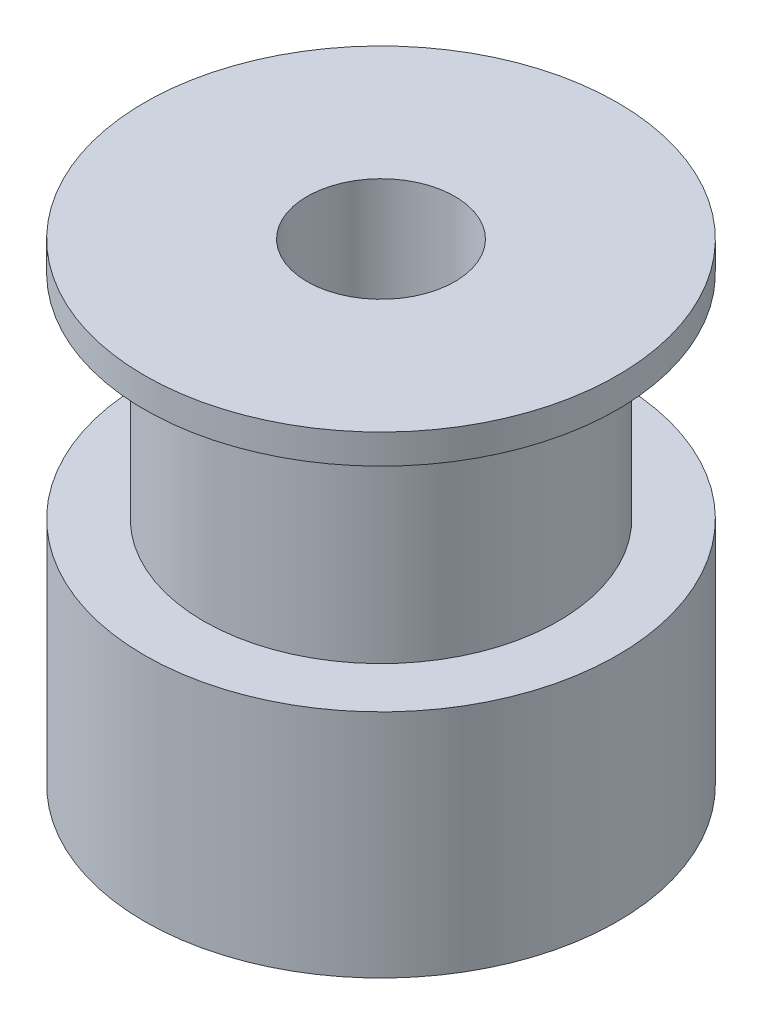
ISO-10303-21;
HEADER;
FILE_DESCRIPTION(('STEP AP214'),'2;1');
FILE_NAME('part.step','',(''),(''),'','','');
FILE_SCHEMA(('AUTOMOTIVE_DESIGN { 1 0 10303 214 1 1 1 1 }'));
ENDSEC;
DATA;
#1=APPLICATION_CONTEXT('core data for automotive mechanical design processes');
#2=APPLICATION_PROTOCOL_DEFINITION('international standard','automotive_design',2000,#1);
#3=PRODUCT_CONTEXT('',#1,'mechanical');
#4=PRODUCT('Part','Part','',(#3));
#5=PRODUCT_RELATED_PRODUCT_CATEGORY('part','',(#4));
#6=PRODUCT_DEFINITION_FORMATION('','',#4);
#7=PRODUCT_DEFINITION_CONTEXT('part definition',#1,'design');
#8=PRODUCT_DEFINITION('design','',#6,#7);
#9=PRODUCT_DEFINITION_SHAPE('','',#8);
#10=(LENGTH_UNIT() NAMED_UNIT(*) SI_UNIT(.MILLI.,.METRE.));
#11=(NAMED_UNIT(*) PLANE_ANGLE_UNIT() SI_UNIT($,.RADIAN.));
#12=(NAMED_UNIT(*) SI_UNIT($,.STERADIAN.) SOLID_ANGLE_UNIT());
#13=UNCERTAINTY_MEASURE_WITH_UNIT(LENGTH_MEASURE(1.E-05),#10,'distance_accuracy_value','');
#14=(GEOMETRIC_REPRESENTATION_CONTEXT(3) GLOBAL_UNCERTAINTY_ASSIGNED_CONTEXT((#13)) GLOBAL_UNIT_ASSIGNED_CONTEXT((#10,
#11,#12)) REPRESENTATION_CONTEXT('',''));
#15=CARTESIAN_POINT('',(0.,0.,0.));
#16=DIRECTION('',(0.,0.,1.));
#17=DIRECTION('',(1.,0.,0.));
#18=AXIS2_PLACEMENT_3D('',#15,#16,#17);
#19=CARTESIAN_POINT('',(0.,16.,0.));
#20=DIRECTION('',(0.,-1.,0.));
#21=DIRECTION('',(0.,0.,-1.));
#22=AXIS2_PLACEMENT_3D('',#19,#20,#21);
#23=CYLINDRICAL_SURFACE('',#22,8.);
#24=CARTESIAN_POINT('',(0.,0.,0.));
#25=DIRECTION('',(0.,1.,0.));
#26=DIRECTION('',(0.,0.,1.));
#27=AXIS2_PLACEMENT_3D('',#24,#25,#26);
#28=CIRCLE('',#27,8.);
#29=CARTESIAN_POINT('',(0.,0.,8.));
#30=VERTEX_POINT('',#29);
#31=EDGE_CURVE('E39',#30,#30,#28,.T.);
#32=ORIENTED_EDGE('',*,*,#31,.T.);
#33=EDGE_LOOP('',(#32));
#34=FACE_BOUND('',#33,.T.);
#35=CARTESIAN_POINT('',(0.,7.8,0.));
#36=DIRECTION('',(0.,1.,0.));
#37=DIRECTION('',(0.,0.,1.));
#38=AXIS2_PLACEMENT_3D('',#35,#36,#37);
#39=CIRCLE('',#38,8.);
#40=CARTESIAN_POINT('',(0.,7.8,8.));
#41=VERTEX_POINT('',#40);
#42=EDGE_CURVE('E35',#41,#41,#39,.T.);
#43=ORIENTED_EDGE('',*,*,#42,.F.);
#44=EDGE_LOOP('',(#43));
#45=FACE_BOUND('',#44,.T.);
#46=ADVANCED_FACE('F32',(#34,#45),#23,.T.);
#47=CARTESIAN_POINT('',(0.,0.,0.));
#48=DIRECTION('',(0.,1.,0.));
#49=DIRECTION('',(0.,0.,1.));
#50=AXIS2_PLACEMENT_3D('',#47,#48,#49);
#51=PLANE('',#50);
#52=CARTESIAN_POINT('',(0.,0.,0.));
#53=DIRECTION('',(0.,1.,0.));
#54=DIRECTION('',(0.,0.,1.));
#55=AXIS2_PLACEMENT_3D('',#52,#53,#54);
#56=CIRCLE('',#55,2.5);
#57=CARTESIAN_POINT('',(0.,0.,2.5));
#58=VERTEX_POINT('',#57);
#59=EDGE_CURVE('E58',#58,#58,#56,.T.);
#60=ORIENTED_EDGE('',*,*,#59,.T.);
#61=EDGE_LOOP('',(#60));
#62=FACE_BOUND('',#61,.T.);
#63=ORIENTED_EDGE('',*,*,#31,.F.);
#64=EDGE_LOOP('',(#63));
#65=FACE_BOUND('',#64,.T.);
#66=ADVANCED_FACE('F83',(#62,#65),#51,.F.);
#67=CARTESIAN_POINT('',(6.,7.8,0.));
#68=DIRECTION('',(0.,1.,0.));
#69=DIRECTION('',(0.,0.,1.));
#70=AXIS2_PLACEMENT_3D('',#67,#68,#69);
#71=PLANE('',#70);
#72=CARTESIAN_POINT('',(0.,7.8,0.));
#73=DIRECTION('',(0.,1.,0.));
#74=DIRECTION('',(0.,0.,1.));
#75=AXIS2_PLACEMENT_3D('',#72,#73,#74);
#76=CIRCLE('',#75,6.);
#77=CARTESIAN_POINT('',(0.,7.8,6.));
#78=VERTEX_POINT('',#77);
#79=EDGE_CURVE('E46',#78,#78,#76,.T.);
#80=ORIENTED_EDGE('',*,*,#79,.F.);
#81=EDGE_LOOP('',(#80));
#82=FACE_BOUND('',#81,.T.);
#83=ORIENTED_EDGE('',*,*,#42,.T.);
#84=EDGE_LOOP('',(#83));
#85=FACE_BOUND('',#84,.T.);
#86=ADVANCED_FACE('F88',(#82,#85),#71,.T.);
#87=CARTESIAN_POINT('',(6.,15.,0.));
#88=DIRECTION('',(0.,-1.,0.));
#89=DIRECTION('',(0.,0.,-1.));
#90=AXIS2_PLACEMENT_3D('',#87,#88,#89);
#91=PLANE('',#90);
#92=CARTESIAN_POINT('',(0.,15.,0.));
#93=DIRECTION('',(0.,1.,0.));
#94=DIRECTION('',(0.,0.,1.));
#95=AXIS2_PLACEMENT_3D('',#92,#93,#94);
#96=CIRCLE('',#95,6.);
#97=CARTESIAN_POINT('',(0.,15.,6.));
#98=VERTEX_POINT('',#97);
#99=EDGE_CURVE('E54',#98,#98,#96,.T.);
#100=ORIENTED_EDGE('',*,*,#99,.T.);
#101=EDGE_LOOP('',(#100));
#102=FACE_BOUND('',#101,.T.);
#103=CARTESIAN_POINT('',(0.,15.,0.));
#104=DIRECTION('',(0.,-1.,0.));
#105=DIRECTION('',(0.,0.,-1.));
#106=AXIS2_PLACEMENT_3D('',#103,#104,#105);
#107=CIRCLE('',#106,8.);
#108=CARTESIAN_POINT('',(0.,15.,-8.));
#109=VERTEX_POINT('',#108);
#110=EDGE_CURVE('E48',#109,#109,#107,.T.);
#111=ORIENTED_EDGE('',*,*,#110,.T.);
#112=EDGE_LOOP('',(#111));
#113=FACE_BOUND('',#112,.T.);
#114=ADVANCED_FACE('F80',(#102,#113),#91,.T.);
#115=CARTESIAN_POINT('',(0.,16.,0.));
#116=DIRECTION('',(0.,1.,0.));
#117=DIRECTION('',(0.,0.,1.));
#118=AXIS2_PLACEMENT_3D('',#115,#116,#117);
#119=CYLINDRICAL_SURFACE('',#118,6.);
#120=ORIENTED_EDGE('',*,*,#79,.T.);
#121=EDGE_LOOP('',(#120));
#122=FACE_BOUND('',#121,.T.);
#123=ORIENTED_EDGE('',*,*,#99,.F.);
#124=EDGE_LOOP('',(#123));
#125=FACE_BOUND('',#124,.T.);
#126=ADVANCED_FACE('F73',(#122,#125),#119,.T.);
#127=CARTESIAN_POINT('',(0.,16.,0.));
#128=DIRECTION('',(0.,1.,0.));
#129=DIRECTION('',(0.,0.,1.));
#130=AXIS2_PLACEMENT_3D('',#127,#128,#129);
#131=PLANE('',#130);
#132=CARTESIAN_POINT('',(0.,16.,0.));
#133=DIRECTION('',(0.,1.,0.));
#134=DIRECTION('',(0.,0.,1.));
#135=AXIS2_PLACEMENT_3D('',#132,#133,#134);
#136=CIRCLE('',#135,2.5);
#137=CARTESIAN_POINT('',(0.,16.,2.5));
#138=VERTEX_POINT('',#137);
#139=EDGE_CURVE('E62',#138,#138,#136,.T.);
#140=ORIENTED_EDGE('',*,*,#139,.F.);
#141=EDGE_LOOP('',(#140));
#142=FACE_BOUND('',#141,.T.);
#143=CARTESIAN_POINT('',(0.,16.,0.));
#144=DIRECTION('',(0.,1.,0.));
#145=DIRECTION('',(0.,0.,1.));
#146=AXIS2_PLACEMENT_3D('',#143,#144,#145);
#147=CIRCLE('',#146,8.);
#148=CARTESIAN_POINT('',(0.,16.,8.));
#149=VERTEX_POINT('',#148);
#150=EDGE_CURVE('E10',#149,#149,#147,.T.);
#151=ORIENTED_EDGE('',*,*,#150,.T.);
#152=EDGE_LOOP('',(#151));
#153=FACE_BOUND('',#152,.T.);
#154=ADVANCED_FACE('F70',(#142,#153),#131,.T.);
#155=ORIENTED_EDGE('',*,*,#150,.F.);
#156=EDGE_LOOP('',(#155));
#157=FACE_BOUND('',#156,.T.);
#158=ORIENTED_EDGE('',*,*,#110,.F.);
#159=EDGE_LOOP('',(#158));
#160=FACE_BOUND('',#159,.T.);
#161=ADVANCED_FACE('F72',(#157,#160),#23,.T.);
#162=CARTESIAN_POINT('',(0.,0.,0.));
#163=DIRECTION('',(0.,1.,0.));
#164=DIRECTION('',(0.,0.,1.));
#165=AXIS2_PLACEMENT_3D('',#162,#163,#164);
#166=CYLINDRICAL_SURFACE('',#165,2.5);
#167=ORIENTED_EDGE('',*,*,#59,.F.);
#168=EDGE_LOOP('',(#167));
#169=FACE_BOUND('',#168,.T.);
#170=ORIENTED_EDGE('',*,*,#139,.T.);
#171=EDGE_LOOP('',(#170));
#172=FACE_BOUND('',#171,.T.);
#173=ADVANCED_FACE('F68',(#169,#172),#166,.F.);
#174=CLOSED_SHELL('',(#46,#66,#86,#114,#126,#154,#161,#173));
#175=MANIFOLD_SOLID_BREP('B2',#174);
#176=ADVANCED_BREP_SHAPE_REPRESENTATION('',(#18,#175),#14);
#177=SHAPE_DEFINITION_REPRESENTATION(#9,#176);
ENDSEC;
END-ISO-10303-21;
